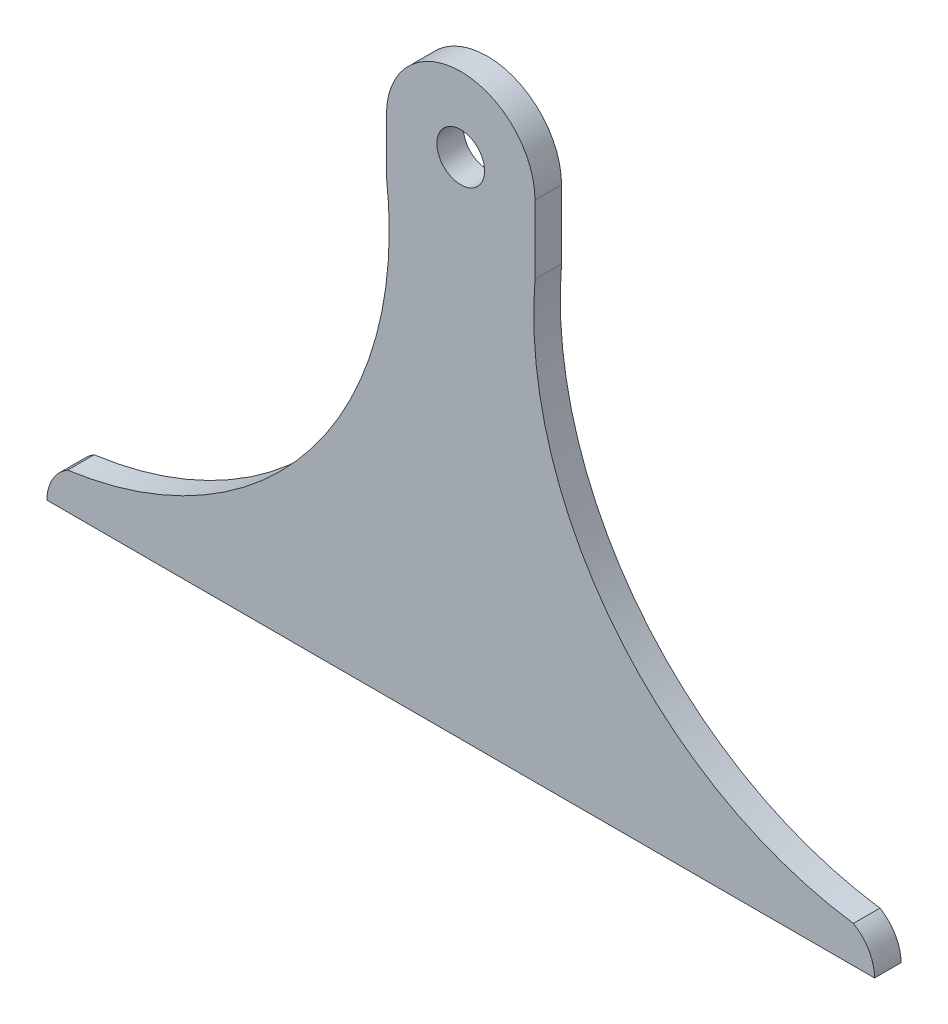
ISO-10303-21;
HEADER;
FILE_DESCRIPTION(('STEP AP214'),'2;1');
FILE_NAME('part.step','',(''),(''),'','','');
FILE_SCHEMA(('AUTOMOTIVE_DESIGN { 1 0 10303 214 1 1 1 1 }'));
ENDSEC;
DATA;
#1=APPLICATION_CONTEXT('core data for automotive mechanical design processes');
#2=APPLICATION_PROTOCOL_DEFINITION('international standard','automotive_design',2000,#1);
#3=PRODUCT_CONTEXT('',#1,'mechanical');
#4=PRODUCT('Part','Part','',(#3));
#5=PRODUCT_RELATED_PRODUCT_CATEGORY('part','',(#4));
#6=PRODUCT_DEFINITION_FORMATION('','',#4);
#7=PRODUCT_DEFINITION_CONTEXT('part definition',#1,'design');
#8=PRODUCT_DEFINITION('design','',#6,#7);
#9=PRODUCT_DEFINITION_SHAPE('','',#8);
#10=(LENGTH_UNIT() NAMED_UNIT(*) SI_UNIT(.MILLI.,.METRE.));
#11=(NAMED_UNIT(*) PLANE_ANGLE_UNIT() SI_UNIT($,.RADIAN.));
#12=(NAMED_UNIT(*) SI_UNIT($,.STERADIAN.) SOLID_ANGLE_UNIT());
#13=UNCERTAINTY_MEASURE_WITH_UNIT(LENGTH_MEASURE(1.E-05),#10,'distance_accuracy_value','');
#14=(GEOMETRIC_REPRESENTATION_CONTEXT(3) GLOBAL_UNCERTAINTY_ASSIGNED_CONTEXT((#13)) GLOBAL_UNIT_ASSIGNED_CONTEXT((#10,
#11,#12)) REPRESENTATION_CONTEXT('',''));
#15=CARTESIAN_POINT('',(0.,0.,0.));
#16=DIRECTION('',(0.,0.,1.));
#17=DIRECTION('',(1.,0.,0.));
#18=AXIS2_PLACEMENT_3D('',#15,#16,#17);
#19=CARTESIAN_POINT('',(-83.4764976022931,-18.7629470941756,5.));
#20=DIRECTION('',(0.,0.,-1.));
#21=DIRECTION('',(-1.,0.,0.));
#22=AXIS2_PLACEMENT_3D('',#19,#20,#21);
#23=CYLINDRICAL_SURFACE('',#22,70.);
#24=CARTESIAN_POINT('',(-83.4764976022931,-18.7629470941756,0.));
#25=DIRECTION('',(0.,0.,1.));
#26=DIRECTION('',(1.,0.,0.));
#27=AXIS2_PLACEMENT_3D('',#24,#25,#26);
#28=CIRCLE('',#27,70.);
#29=CARTESIAN_POINT('',(-74.1034880322403,-88.1325852048051,0.));
#30=VERTEX_POINT('',#29);
#31=CARTESIAN_POINT('',(-14.,-10.2179906332822,0.));
#32=VERTEX_POINT('',#31);
#33=EDGE_CURVE('E133',#30,#32,#28,.T.);
#34=ORIENTED_EDGE('',*,*,#33,.F.);
#35=DIRECTION('',(0.,0.,-1.));
#36=VECTOR('',#35,1.);
#37=CARTESIAN_POINT('',(-74.1034880322403,-88.1325852048051,5.));
#38=LINE('',#37,#36);
#39=CARTESIAN_POINT('',(-74.1034880322403,-88.1325852048051,5.));
#40=VERTEX_POINT('',#39);
#41=EDGE_CURVE('E11',#40,#30,#38,.T.);
#42=ORIENTED_EDGE('',*,*,#41,.F.);
#43=CARTESIAN_POINT('',(-83.4764976022931,-18.7629470941756,5.));
#44=DIRECTION('',(0.,0.,1.));
#45=DIRECTION('',(1.,0.,0.));
#46=AXIS2_PLACEMENT_3D('',#43,#44,#45);
#47=CIRCLE('',#46,70.);
#48=CARTESIAN_POINT('',(-14.,-10.2179906332822,5.));
#49=VERTEX_POINT('',#48);
#50=EDGE_CURVE('E153',#40,#49,#47,.T.);
#51=ORIENTED_EDGE('',*,*,#50,.T.);
#52=DIRECTION('',(0.,0.,-1.));
#53=VECTOR('',#52,1.);
#54=CARTESIAN_POINT('',(-14.,-10.2179906332822,5.));
#55=LINE('',#54,#53);
#56=EDGE_CURVE('E85',#49,#32,#55,.T.);
#57=ORIENTED_EDGE('',*,*,#56,.T.);
#58=EDGE_LOOP('',(#34,#42,#51,#57));
#59=FACE_BOUND('',#58,.T.);
#60=ADVANCED_FACE('F35',(#59),#23,.F.);
#61=CARTESIAN_POINT('',(-70.,-95.,5.));
#62=DIRECTION('',(0.,0.,-1.));
#63=DIRECTION('',(-1.,0.,0.));
#64=AXIS2_PLACEMENT_3D('',#61,#62,#63);
#65=CYLINDRICAL_SURFACE('',#64,8.00000000000003);
#66=CARTESIAN_POINT('',(-70.,-95.,0.));
#67=DIRECTION('',(0.,0.,1.));
#68=DIRECTION('',(1.,0.,0.));
#69=AXIS2_PLACEMENT_3D('',#66,#67,#68);
#70=CIRCLE('',#69,8.00000000000003);
#71=CARTESIAN_POINT('',(-78.,-95.,0.));
#72=VERTEX_POINT('',#71);
#73=EDGE_CURVE('E136',#30,#72,#70,.T.);
#74=ORIENTED_EDGE('',*,*,#73,.T.);
#75=DIRECTION('',(0.,0.,-1.));
#76=VECTOR('',#75,1.);
#77=CARTESIAN_POINT('',(-78.,-95.,5.));
#78=LINE('',#77,#76);
#79=CARTESIAN_POINT('',(-78.,-95.,5.));
#80=VERTEX_POINT('',#79);
#81=EDGE_CURVE('E43',#80,#72,#78,.T.);
#82=ORIENTED_EDGE('',*,*,#81,.F.);
#83=CARTESIAN_POINT('',(-70.,-95.,5.));
#84=DIRECTION('',(0.,0.,1.));
#85=DIRECTION('',(1.,0.,0.));
#86=AXIS2_PLACEMENT_3D('',#83,#84,#85);
#87=CIRCLE('',#86,8.00000000000003);
#88=EDGE_CURVE('E180',#40,#80,#87,.T.);
#89=ORIENTED_EDGE('',*,*,#88,.F.);
#90=ORIENTED_EDGE('',*,*,#41,.T.);
#91=EDGE_LOOP('',(#74,#82,#89,#90));
#92=FACE_BOUND('',#91,.T.);
#93=ADVANCED_FACE('F184',(#92),#65,.T.);
#94=CARTESIAN_POINT('',(0.,-95.,5.));
#95=DIRECTION('',(0.,1.,0.));
#96=DIRECTION('',(-1.,0.,0.));
#97=AXIS2_PLACEMENT_3D('',#94,#95,#96);
#98=PLANE('',#97);
#99=DIRECTION('',(1.,0.,0.));
#100=VECTOR('',#99,1.);
#101=CARTESIAN_POINT('',(0.,-95.,0.));
#102=LINE('',#101,#100);
#103=CARTESIAN_POINT('',(78.,-95.,0.));
#104=VERTEX_POINT('',#103);
#105=EDGE_CURVE('E138',#72,#104,#102,.T.);
#106=ORIENTED_EDGE('',*,*,#105,.T.);
#107=DIRECTION('',(0.,0.,-1.));
#108=VECTOR('',#107,1.);
#109=CARTESIAN_POINT('',(78.,-95.,5.));
#110=LINE('',#109,#108);
#111=CARTESIAN_POINT('',(78.,-95.,5.));
#112=VERTEX_POINT('',#111);
#113=EDGE_CURVE('E159',#112,#104,#110,.T.);
#114=ORIENTED_EDGE('',*,*,#113,.F.);
#115=DIRECTION('',(1.,0.,0.));
#116=VECTOR('',#115,1.);
#117=CARTESIAN_POINT('',(0.,-95.,5.));
#118=LINE('',#117,#116);
#119=EDGE_CURVE('E168',#80,#112,#118,.T.);
#120=ORIENTED_EDGE('',*,*,#119,.F.);
#121=ORIENTED_EDGE('',*,*,#81,.T.);
#122=EDGE_LOOP('',(#106,#114,#120,#121));
#123=FACE_BOUND('',#122,.T.);
#124=ADVANCED_FACE('F166',(#123),#98,.F.);
#125=CARTESIAN_POINT('',(70.,-95.,5.));
#126=DIRECTION('',(0.,0.,-1.));
#127=DIRECTION('',(-1.,0.,0.));
#128=AXIS2_PLACEMENT_3D('',#125,#126,#127);
#129=CYLINDRICAL_SURFACE('',#128,7.99999999999999);
#130=CARTESIAN_POINT('',(70.,-95.,0.));
#131=DIRECTION('',(0.,0.,1.));
#132=DIRECTION('',(1.,0.,0.));
#133=AXIS2_PLACEMENT_3D('',#130,#131,#132);
#134=CIRCLE('',#133,7.99999999999999);
#135=CARTESIAN_POINT('',(74.018096633248,-88.0822764260285,0.));
#136=VERTEX_POINT('',#135);
#137=EDGE_CURVE('E140',#104,#136,#134,.T.);
#138=ORIENTED_EDGE('',*,*,#137,.T.);
#139=DIRECTION('',(0.,0.,-1.));
#140=VECTOR('',#139,1.);
#141=CARTESIAN_POINT('',(74.018096633248,-88.0822764260285,5.));
#142=LINE('',#141,#140);
#143=CARTESIAN_POINT('',(74.018096633248,-88.0822764260285,5.));
#144=VERTEX_POINT('',#143);
#145=EDGE_CURVE('E157',#144,#136,#142,.T.);
#146=ORIENTED_EDGE('',*,*,#145,.F.);
#147=CARTESIAN_POINT('',(70.,-95.,5.));
#148=DIRECTION('',(0.,0.,1.));
#149=DIRECTION('',(1.,0.,0.));
#150=AXIS2_PLACEMENT_3D('',#147,#148,#149);
#151=CIRCLE('',#150,7.99999999999999);
#152=EDGE_CURVE('E125',#112,#144,#151,.T.);
#153=ORIENTED_EDGE('',*,*,#152,.F.);
#154=ORIENTED_EDGE('',*,*,#113,.T.);
#155=EDGE_LOOP('',(#138,#146,#153,#154));
#156=FACE_BOUND('',#155,.T.);
#157=ADVANCED_FACE('F178',(#156),#129,.T.);
#158=CARTESIAN_POINT('',(83.7561960875632,-18.7629470941756,5.));
#159=DIRECTION('',(0.,0.,-1.));
#160=DIRECTION('',(-1.,0.,0.));
#161=AXIS2_PLACEMENT_3D('',#158,#159,#160);
#162=CYLINDRICAL_SURFACE('',#161,70.);
#163=CARTESIAN_POINT('',(83.7561960875632,-18.7629470941756,0.));
#164=DIRECTION('',(0.,0.,1.));
#165=DIRECTION('',(1.,0.,0.));
#166=AXIS2_PLACEMENT_3D('',#163,#164,#165);
#167=CIRCLE('',#166,70.);
#168=CARTESIAN_POINT('',(14.,-12.9257296583213,0.));
#169=VERTEX_POINT('',#168);
#170=EDGE_CURVE('E143',#169,#136,#167,.T.);
#171=ORIENTED_EDGE('',*,*,#170,.F.);
#172=DIRECTION('',(0.,0.,-1.));
#173=VECTOR('',#172,1.);
#174=CARTESIAN_POINT('',(14.,-12.9257296583213,5.));
#175=LINE('',#174,#173);
#176=CARTESIAN_POINT('',(14.,-12.9257296583213,5.));
#177=VERTEX_POINT('',#176);
#178=EDGE_CURVE('E113',#177,#169,#175,.T.);
#179=ORIENTED_EDGE('',*,*,#178,.F.);
#180=CARTESIAN_POINT('',(83.7561960875632,-18.7629470941756,5.));
#181=DIRECTION('',(0.,0.,1.));
#182=DIRECTION('',(1.,0.,0.));
#183=AXIS2_PLACEMENT_3D('',#180,#181,#182);
#184=CIRCLE('',#183,70.);
#185=EDGE_CURVE('E123',#177,#144,#184,.T.);
#186=ORIENTED_EDGE('',*,*,#185,.T.);
#187=ORIENTED_EDGE('',*,*,#145,.T.);
#188=EDGE_LOOP('',(#171,#179,#186,#187));
#189=FACE_BOUND('',#188,.T.);
#190=ADVANCED_FACE('F194',(#189),#162,.F.);
#191=CARTESIAN_POINT('',(14.,0.,5.));
#192=DIRECTION('',(1.,0.,0.));
#193=DIRECTION('',(0.,1.,0.));
#194=AXIS2_PLACEMENT_3D('',#191,#192,#193);
#195=PLANE('',#194);
#196=DIRECTION('',(0.,-1.,0.));
#197=VECTOR('',#196,1.);
#198=CARTESIAN_POINT('',(14.,0.,0.));
#199=LINE('',#198,#197);
#200=CARTESIAN_POINT('',(14.,0.,0.));
#201=VERTEX_POINT('',#200);
#202=EDGE_CURVE('E112',#201,#169,#199,.T.);
#203=ORIENTED_EDGE('',*,*,#202,.F.);
#204=DIRECTION('',(0.,0.,-1.));
#205=VECTOR('',#204,1.);
#206=CARTESIAN_POINT('',(14.,0.,5.));
#207=LINE('',#206,#205);
#208=CARTESIAN_POINT('',(14.,0.,5.));
#209=VERTEX_POINT('',#208);
#210=EDGE_CURVE('E106',#209,#201,#207,.T.);
#211=ORIENTED_EDGE('',*,*,#210,.F.);
#212=DIRECTION('',(0.,-1.,0.));
#213=VECTOR('',#212,1.);
#214=CARTESIAN_POINT('',(14.,0.,5.));
#215=LINE('',#214,#213);
#216=EDGE_CURVE('E110',#209,#177,#215,.T.);
#217=ORIENTED_EDGE('',*,*,#216,.T.);
#218=ORIENTED_EDGE('',*,*,#178,.T.);
#219=EDGE_LOOP('',(#203,#211,#217,#218));
#220=FACE_BOUND('',#219,.T.);
#221=ADVANCED_FACE('F108',(#220),#195,.T.);
#222=CARTESIAN_POINT('',(0.,0.,5.));
#223=DIRECTION('',(0.,0.,-1.));
#224=DIRECTION('',(-1.,0.,0.));
#225=AXIS2_PLACEMENT_3D('',#222,#223,#224);
#226=CYLINDRICAL_SURFACE('',#225,14.);
#227=CARTESIAN_POINT('',(0.,0.,0.));
#228=DIRECTION('',(0.,0.,1.));
#229=DIRECTION('',(1.,0.,0.));
#230=AXIS2_PLACEMENT_3D('',#227,#228,#229);
#231=CIRCLE('',#230,14.);
#232=CARTESIAN_POINT('',(-14.,0.,0.));
#233=VERTEX_POINT('',#232);
#234=EDGE_CURVE('E78',#201,#233,#231,.T.);
#235=ORIENTED_EDGE('',*,*,#234,.T.);
#236=DIRECTION('',(0.,0.,-1.));
#237=VECTOR('',#236,1.);
#238=CARTESIAN_POINT('',(-14.,0.,5.));
#239=LINE('',#238,#237);
#240=CARTESIAN_POINT('',(-14.,0.,5.));
#241=VERTEX_POINT('',#240);
#242=EDGE_CURVE('E114',#241,#233,#239,.T.);
#243=ORIENTED_EDGE('',*,*,#242,.F.);
#244=CARTESIAN_POINT('',(0.,0.,5.));
#245=DIRECTION('',(0.,0.,1.));
#246=DIRECTION('',(1.,0.,0.));
#247=AXIS2_PLACEMENT_3D('',#244,#245,#246);
#248=CIRCLE('',#247,14.);
#249=EDGE_CURVE('E116',#209,#241,#248,.T.);
#250=ORIENTED_EDGE('',*,*,#249,.F.);
#251=ORIENTED_EDGE('',*,*,#210,.T.);
#252=EDGE_LOOP('',(#235,#243,#250,#251));
#253=FACE_BOUND('',#252,.T.);
#254=ADVANCED_FACE('F117',(#253),#226,.T.);
#255=CARTESIAN_POINT('',(-14.,0.,5.));
#256=DIRECTION('',(1.,0.,0.));
#257=DIRECTION('',(0.,1.,0.));
#258=AXIS2_PLACEMENT_3D('',#255,#256,#257);
#259=PLANE('',#258);
#260=DIRECTION('',(0.,-1.,0.));
#261=VECTOR('',#260,1.);
#262=CARTESIAN_POINT('',(-14.,0.,0.));
#263=LINE('',#262,#261);
#264=EDGE_CURVE('E148',#233,#32,#263,.T.);
#265=ORIENTED_EDGE('',*,*,#264,.T.);
#266=ORIENTED_EDGE('',*,*,#56,.F.);
#267=DIRECTION('',(0.,-1.,0.));
#268=VECTOR('',#267,1.);
#269=CARTESIAN_POINT('',(-14.,0.,5.));
#270=LINE('',#269,#268);
#271=EDGE_CURVE('E51',#241,#49,#270,.T.);
#272=ORIENTED_EDGE('',*,*,#271,.F.);
#273=ORIENTED_EDGE('',*,*,#242,.T.);
#274=EDGE_LOOP('',(#265,#266,#272,#273));
#275=FACE_BOUND('',#274,.T.);
#276=ADVANCED_FACE('F202',(#275),#259,.F.);
#277=CARTESIAN_POINT('',(0.,0.,5.));
#278=DIRECTION('',(0.,0.,-1.));
#279=DIRECTION('',(-1.,0.,0.));
#280=AXIS2_PLACEMENT_3D('',#277,#278,#279);
#281=CYLINDRICAL_SURFACE('',#280,4.5);
#282=CARTESIAN_POINT('',(0.,0.,5.));
#283=DIRECTION('',(0.,0.,1.));
#284=DIRECTION('',(1.,0.,0.));
#285=AXIS2_PLACEMENT_3D('',#282,#283,#284);
#286=CIRCLE('',#285,4.5);
#287=CARTESIAN_POINT('',(4.5,0.,5.));
#288=VERTEX_POINT('',#287);
#289=EDGE_CURVE('E130',#288,#288,#286,.T.);
#290=ORIENTED_EDGE('',*,*,#289,.T.);
#291=EDGE_LOOP('',(#290));
#292=FACE_BOUND('',#291,.T.);
#293=CARTESIAN_POINT('',(0.,0.,0.));
#294=DIRECTION('',(0.,0.,1.));
#295=DIRECTION('',(1.,0.,0.));
#296=AXIS2_PLACEMENT_3D('',#293,#294,#295);
#297=CIRCLE('',#296,4.5);
#298=CARTESIAN_POINT('',(4.5,0.,0.));
#299=VERTEX_POINT('',#298);
#300=EDGE_CURVE('E150',#299,#299,#297,.T.);
#301=ORIENTED_EDGE('',*,*,#300,.F.);
#302=EDGE_LOOP('',(#301));
#303=FACE_BOUND('',#302,.T.);
#304=ADVANCED_FACE('F205',(#292,#303),#281,.F.);
#305=CARTESIAN_POINT('',(0.,0.,5.));
#306=DIRECTION('',(0.,0.,1.));
#307=DIRECTION('',(1.,0.,0.));
#308=AXIS2_PLACEMENT_3D('',#305,#306,#307);
#309=PLANE('',#308);
#310=ORIENTED_EDGE('',*,*,#50,.F.);
#311=ORIENTED_EDGE('',*,*,#88,.T.);
#312=ORIENTED_EDGE('',*,*,#119,.T.);
#313=ORIENTED_EDGE('',*,*,#152,.T.);
#314=ORIENTED_EDGE('',*,*,#185,.F.);
#315=ORIENTED_EDGE('',*,*,#216,.F.);
#316=ORIENTED_EDGE('',*,*,#249,.T.);
#317=ORIENTED_EDGE('',*,*,#271,.T.);
#318=EDGE_LOOP('',(#310,#311,#312,#313,#314,#315,#316,#317));
#319=FACE_BOUND('',#318,.T.);
#320=ORIENTED_EDGE('',*,*,#289,.F.);
#321=EDGE_LOOP('',(#320));
#322=FACE_BOUND('',#321,.T.);
#323=ADVANCED_FACE('F120',(#319,#322),#309,.T.);
#324=CARTESIAN_POINT('',(0.,0.,0.));
#325=DIRECTION('',(0.,0.,1.));
#326=DIRECTION('',(1.,0.,0.));
#327=AXIS2_PLACEMENT_3D('',#324,#325,#326);
#328=PLANE('',#327);
#329=ORIENTED_EDGE('',*,*,#33,.T.);
#330=ORIENTED_EDGE('',*,*,#264,.F.);
#331=ORIENTED_EDGE('',*,*,#234,.F.);
#332=ORIENTED_EDGE('',*,*,#202,.T.);
#333=ORIENTED_EDGE('',*,*,#170,.T.);
#334=ORIENTED_EDGE('',*,*,#137,.F.);
#335=ORIENTED_EDGE('',*,*,#105,.F.);
#336=ORIENTED_EDGE('',*,*,#73,.F.);
#337=EDGE_LOOP('',(#329,#330,#331,#332,#333,#334,#335,#336));
#338=FACE_BOUND('',#337,.T.);
#339=ORIENTED_EDGE('',*,*,#300,.T.);
#340=EDGE_LOOP('',(#339));
#341=FACE_BOUND('',#340,.T.);
#342=ADVANCED_FACE('F173',(#338,#341),#328,.F.);
#343=CLOSED_SHELL('',(#60,#93,#124,#157,#190,#221,#254,#276,#304,#323,#342));
#344=MANIFOLD_SOLID_BREP('B2',#343);
#345=ADVANCED_BREP_SHAPE_REPRESENTATION('',(#18,#344),#14);
#346=SHAPE_DEFINITION_REPRESENTATION(#9,#345);
ENDSEC;
END-ISO-10303-21;
